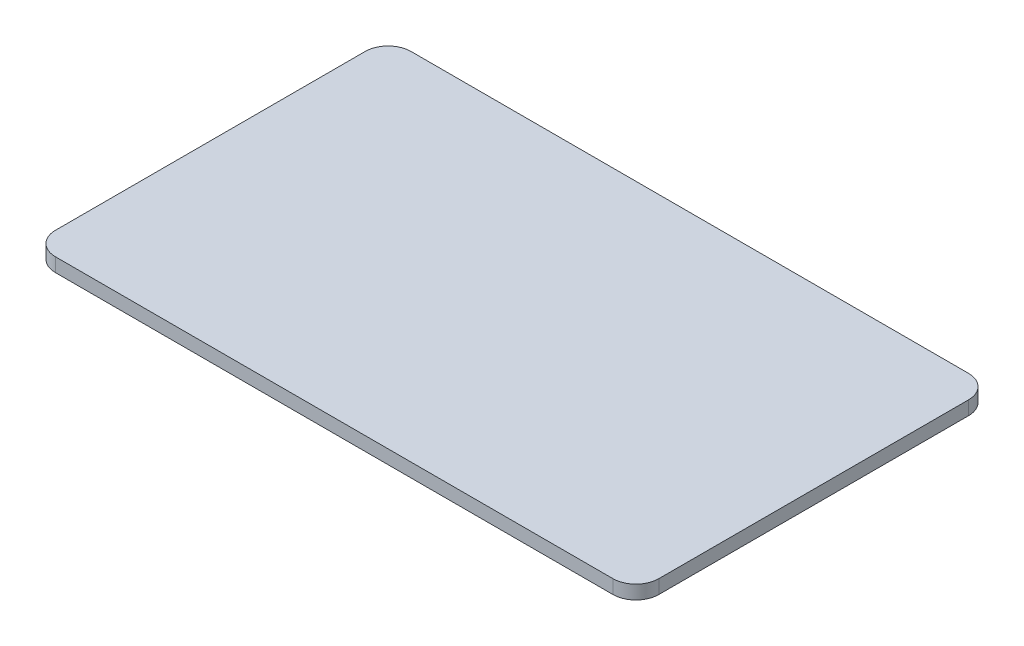
ISO-10303-21;
HEADER;
FILE_DESCRIPTION(('STEP AP214'),'2;1');
FILE_NAME('part.step','',(''),(''),'','','');
FILE_SCHEMA(('AUTOMOTIVE_DESIGN { 1 0 10303 214 1 1 1 1 }'));
ENDSEC;
DATA;
#1=APPLICATION_CONTEXT('core data for automotive mechanical design processes');
#2=APPLICATION_PROTOCOL_DEFINITION('international standard','automotive_design',2000,#1);
#3=PRODUCT_CONTEXT('',#1,'mechanical');
#4=PRODUCT('Part','Part','',(#3));
#5=PRODUCT_RELATED_PRODUCT_CATEGORY('part','',(#4));
#6=PRODUCT_DEFINITION_FORMATION('','',#4);
#7=PRODUCT_DEFINITION_CONTEXT('part definition',#1,'design');
#8=PRODUCT_DEFINITION('design','',#6,#7);
#9=PRODUCT_DEFINITION_SHAPE('','',#8);
#10=(LENGTH_UNIT() NAMED_UNIT(*) SI_UNIT(.MILLI.,.METRE.));
#11=(NAMED_UNIT(*) PLANE_ANGLE_UNIT() SI_UNIT($,.RADIAN.));
#12=(NAMED_UNIT(*) SI_UNIT($,.STERADIAN.) SOLID_ANGLE_UNIT());
#13=UNCERTAINTY_MEASURE_WITH_UNIT(LENGTH_MEASURE(1.E-05),#10,'distance_accuracy_value','');
#14=(GEOMETRIC_REPRESENTATION_CONTEXT(3) GLOBAL_UNCERTAINTY_ASSIGNED_CONTEXT((#13)) GLOBAL_UNIT_ASSIGNED_CONTEXT((#10,
#11,#12)) REPRESENTATION_CONTEXT('',''));
#15=CARTESIAN_POINT('',(0.,0.,0.));
#16=DIRECTION('',(0.,0.,1.));
#17=DIRECTION('',(1.,0.,0.));
#18=AXIS2_PLACEMENT_3D('',#15,#16,#17);
#19=CARTESIAN_POINT('',(-58.7360579092282,3.81,20.7769214580287));
#20=DIRECTION('',(0.,-1.,0.));
#21=DIRECTION('',(0.,0.,-1.));
#22=AXIS2_PLACEMENT_3D('',#19,#20,#21);
#23=CYLINDRICAL_SURFACE('',#22,6.34999999999999);
#24=CARTESIAN_POINT('',(-58.7360579092282,0.,20.7769214580287));
#25=DIRECTION('',(0.,1.,0.));
#26=DIRECTION('',(0.,0.,1.));
#27=AXIS2_PLACEMENT_3D('',#24,#25,#26);
#28=CIRCLE('',#27,6.34999999999999);
#29=CARTESIAN_POINT('',(-65.0860579092282,0.,20.7769214580287));
#30=VERTEX_POINT('',#29);
#31=CARTESIAN_POINT('',(-58.7360579092282,0.,27.1269214580288));
#32=VERTEX_POINT('',#31);
#33=EDGE_CURVE('E129',#30,#32,#28,.T.);
#34=ORIENTED_EDGE('',*,*,#33,.T.);
#35=DIRECTION('',(0.,-1.,0.));
#36=VECTOR('',#35,1.);
#37=CARTESIAN_POINT('',(-58.7360579092282,3.81,27.1269214580288));
#38=LINE('',#37,#36);
#39=CARTESIAN_POINT('',(-58.7360579092282,3.81,27.1269214580288));
#40=VERTEX_POINT('',#39);
#41=EDGE_CURVE('E11',#40,#32,#38,.T.);
#42=ORIENTED_EDGE('',*,*,#41,.F.);
#43=CARTESIAN_POINT('',(-58.7360579092282,3.81,20.7769214580287));
#44=DIRECTION('',(0.,1.,0.));
#45=DIRECTION('',(0.,0.,1.));
#46=AXIS2_PLACEMENT_3D('',#43,#44,#45);
#47=CIRCLE('',#46,6.34999999999999);
#48=CARTESIAN_POINT('',(-65.0860579092282,3.81,20.7769214580287));
#49=VERTEX_POINT('',#48);
#50=EDGE_CURVE('E143',#49,#40,#47,.T.);
#51=ORIENTED_EDGE('',*,*,#50,.F.);
#52=DIRECTION('',(0.,-1.,0.));
#53=VECTOR('',#52,1.);
#54=CARTESIAN_POINT('',(-65.0860579092282,3.81,20.7769214580287));
#55=LINE('',#54,#53);
#56=EDGE_CURVE('E125',#49,#30,#55,.T.);
#57=ORIENTED_EDGE('',*,*,#56,.T.);
#58=EDGE_LOOP('',(#34,#42,#51,#57));
#59=FACE_BOUND('',#58,.T.);
#60=ADVANCED_FACE('F33',(#59),#23,.T.);
#61=CARTESIAN_POINT('',(-58.7360579092282,3.81,27.1269214580288));
#62=DIRECTION('',(0.,0.,-1.));
#63=DIRECTION('',(-1.,0.,0.));
#64=AXIS2_PLACEMENT_3D('',#61,#62,#63);
#65=PLANE('',#64);
#66=DIRECTION('',(1.,0.,0.));
#67=VECTOR('',#66,1.);
#68=CARTESIAN_POINT('',(-58.7360579092282,0.,27.1269214580288));
#69=LINE('',#68,#67);
#70=CARTESIAN_POINT('',(95.5689420907718,0.,27.1269214580288));
#71=VERTEX_POINT('',#70);
#72=EDGE_CURVE('E132',#32,#71,#69,.T.);
#73=ORIENTED_EDGE('',*,*,#72,.T.);
#74=DIRECTION('',(0.,-1.,0.));
#75=VECTOR('',#74,1.);
#76=CARTESIAN_POINT('',(95.5689420907718,3.81,27.1269214580288));
#77=LINE('',#76,#75);
#78=CARTESIAN_POINT('',(95.5689420907718,3.81,27.1269214580288));
#79=VERTEX_POINT('',#78);
#80=EDGE_CURVE('E41',#79,#71,#77,.T.);
#81=ORIENTED_EDGE('',*,*,#80,.F.);
#82=DIRECTION('',(1.,0.,0.));
#83=VECTOR('',#82,1.);
#84=CARTESIAN_POINT('',(-58.7360579092282,3.81,27.1269214580288));
#85=LINE('',#84,#83);
#86=EDGE_CURVE('E92',#40,#79,#85,.T.);
#87=ORIENTED_EDGE('',*,*,#86,.F.);
#88=ORIENTED_EDGE('',*,*,#41,.T.);
#89=EDGE_LOOP('',(#73,#81,#87,#88));
#90=FACE_BOUND('',#89,.T.);
#91=ADVANCED_FACE('F178',(#90),#65,.F.);
#92=CARTESIAN_POINT('',(95.5689420907718,3.81,20.7769214580287));
#93=DIRECTION('',(0.,-1.,0.));
#94=DIRECTION('',(0.,0.,-1.));
#95=AXIS2_PLACEMENT_3D('',#92,#93,#94);
#96=CYLINDRICAL_SURFACE('',#95,6.35);
#97=CARTESIAN_POINT('',(95.5689420907718,0.,20.7769214580287));
#98=DIRECTION('',(0.,1.,0.));
#99=DIRECTION('',(0.,0.,1.));
#100=AXIS2_PLACEMENT_3D('',#97,#98,#99);
#101=CIRCLE('',#100,6.35);
#102=CARTESIAN_POINT('',(101.918942090772,0.,20.7769214580287));
#103=VERTEX_POINT('',#102);
#104=EDGE_CURVE('E134',#71,#103,#101,.T.);
#105=ORIENTED_EDGE('',*,*,#104,.T.);
#106=DIRECTION('',(0.,-1.,0.));
#107=VECTOR('',#106,1.);
#108=CARTESIAN_POINT('',(101.918942090772,3.81,20.7769214580287));
#109=LINE('',#108,#107);
#110=CARTESIAN_POINT('',(101.918942090772,3.81,20.7769214580287));
#111=VERTEX_POINT('',#110);
#112=EDGE_CURVE('E150',#111,#103,#109,.T.);
#113=ORIENTED_EDGE('',*,*,#112,.F.);
#114=CARTESIAN_POINT('',(95.5689420907718,3.81,20.7769214580287));
#115=DIRECTION('',(0.,1.,0.));
#116=DIRECTION('',(0.,0.,1.));
#117=AXIS2_PLACEMENT_3D('',#114,#115,#116);
#118=CIRCLE('',#117,6.35);
#119=EDGE_CURVE('E158',#79,#111,#118,.T.);
#120=ORIENTED_EDGE('',*,*,#119,.F.);
#121=ORIENTED_EDGE('',*,*,#80,.T.);
#122=EDGE_LOOP('',(#105,#113,#120,#121));
#123=FACE_BOUND('',#122,.T.);
#124=ADVANCED_FACE('F156',(#123),#96,.T.);
#125=CARTESIAN_POINT('',(101.918942090772,3.81,20.7769214580287));
#126=DIRECTION('',(-1.,0.,0.));
#127=DIRECTION('',(0.,0.,1.));
#128=AXIS2_PLACEMENT_3D('',#125,#126,#127);
#129=PLANE('',#128);
#130=DIRECTION('',(0.,0.,-1.));
#131=VECTOR('',#130,1.);
#132=CARTESIAN_POINT('',(101.918942090772,0.,20.7769214580287));
#133=LINE('',#132,#131);
#134=CARTESIAN_POINT('',(101.918942090772,0.,-64.9480785419713));
#135=VERTEX_POINT('',#134);
#136=EDGE_CURVE('E136',#103,#135,#133,.T.);
#137=ORIENTED_EDGE('',*,*,#136,.T.);
#138=DIRECTION('',(0.,-1.,0.));
#139=VECTOR('',#138,1.);
#140=CARTESIAN_POINT('',(101.918942090772,3.81,-64.9480785419713));
#141=LINE('',#140,#139);
#142=CARTESIAN_POINT('',(101.918942090772,3.81,-64.9480785419713));
#143=VERTEX_POINT('',#142);
#144=EDGE_CURVE('E147',#143,#135,#141,.T.);
#145=ORIENTED_EDGE('',*,*,#144,.F.);
#146=DIRECTION('',(0.,0.,-1.));
#147=VECTOR('',#146,1.);
#148=CARTESIAN_POINT('',(101.918942090772,3.81,20.7769214580287));
#149=LINE('',#148,#147);
#150=EDGE_CURVE('E170',#111,#143,#149,.T.);
#151=ORIENTED_EDGE('',*,*,#150,.F.);
#152=ORIENTED_EDGE('',*,*,#112,.T.);
#153=EDGE_LOOP('',(#137,#145,#151,#152));
#154=FACE_BOUND('',#153,.T.);
#155=ADVANCED_FACE('F166',(#154),#129,.F.);
#156=CARTESIAN_POINT('',(95.5689420907718,3.81,-64.9480785419713));
#157=DIRECTION('',(0.,-1.,0.));
#158=DIRECTION('',(0.,0.,-1.));
#159=AXIS2_PLACEMENT_3D('',#156,#157,#158);
#160=CYLINDRICAL_SURFACE('',#159,6.34999999999999);
#161=CARTESIAN_POINT('',(95.5689420907718,0.,-64.9480785419713));
#162=DIRECTION('',(0.,1.,0.));
#163=DIRECTION('',(0.,0.,1.));
#164=AXIS2_PLACEMENT_3D('',#161,#162,#163);
#165=CIRCLE('',#164,6.34999999999999);
#166=CARTESIAN_POINT('',(95.5689420907718,0.,-71.2980785419713));
#167=VERTEX_POINT('',#166);
#168=EDGE_CURVE('E138',#135,#167,#165,.T.);
#169=ORIENTED_EDGE('',*,*,#168,.T.);
#170=DIRECTION('',(0.,-1.,0.));
#171=VECTOR('',#170,1.);
#172=CARTESIAN_POINT('',(95.5689420907718,3.81,-71.2980785419713));
#173=LINE('',#172,#171);
#174=CARTESIAN_POINT('',(95.5689420907718,3.81,-71.2980785419713));
#175=VERTEX_POINT('',#174);
#176=EDGE_CURVE('E120',#175,#167,#173,.T.);
#177=ORIENTED_EDGE('',*,*,#176,.F.);
#178=CARTESIAN_POINT('',(95.5689420907718,3.81,-64.9480785419713));
#179=DIRECTION('',(0.,1.,0.));
#180=DIRECTION('',(0.,0.,1.));
#181=AXIS2_PLACEMENT_3D('',#178,#179,#180);
#182=CIRCLE('',#181,6.34999999999999);
#183=EDGE_CURVE('E111',#143,#175,#182,.T.);
#184=ORIENTED_EDGE('',*,*,#183,.F.);
#185=ORIENTED_EDGE('',*,*,#144,.T.);
#186=EDGE_LOOP('',(#169,#177,#184,#185));
#187=FACE_BOUND('',#186,.T.);
#188=ADVANCED_FACE('F169',(#187),#160,.T.);
#189=CARTESIAN_POINT('',(95.5689420907718,3.81,-71.2980785419713));
#190=DIRECTION('',(0.,0.,1.));
#191=DIRECTION('',(1.,0.,0.));
#192=AXIS2_PLACEMENT_3D('',#189,#190,#191);
#193=PLANE('',#192);
#194=DIRECTION('',(-1.,0.,0.));
#195=VECTOR('',#194,1.);
#196=CARTESIAN_POINT('',(95.5689420907718,0.,-71.2980785419713));
#197=LINE('',#196,#195);
#198=CARTESIAN_POINT('',(-58.7360579092282,0.,-71.2980785419712));
#199=VERTEX_POINT('',#198);
#200=EDGE_CURVE('E119',#167,#199,#197,.T.);
#201=ORIENTED_EDGE('',*,*,#200,.T.);
#202=DIRECTION('',(0.,-1.,0.));
#203=VECTOR('',#202,1.);
#204=CARTESIAN_POINT('',(-58.7360579092282,3.81,-71.2980785419712));
#205=LINE('',#204,#203);
#206=CARTESIAN_POINT('',(-58.7360579092282,3.81,-71.2980785419712));
#207=VERTEX_POINT('',#206);
#208=EDGE_CURVE('E116',#207,#199,#205,.T.);
#209=ORIENTED_EDGE('',*,*,#208,.F.);
#210=DIRECTION('',(-1.,0.,0.));
#211=VECTOR('',#210,1.);
#212=CARTESIAN_POINT('',(95.5689420907718,3.81,-71.2980785419713));
#213=LINE('',#212,#211);
#214=EDGE_CURVE('E105',#175,#207,#213,.T.);
#215=ORIENTED_EDGE('',*,*,#214,.F.);
#216=ORIENTED_EDGE('',*,*,#176,.T.);
#217=EDGE_LOOP('',(#201,#209,#215,#216));
#218=FACE_BOUND('',#217,.T.);
#219=ADVANCED_FACE('F117',(#218),#193,.F.);
#220=CARTESIAN_POINT('',(-58.7360579092282,3.81,-64.9480785419713));
#221=DIRECTION('',(0.,-1.,0.));
#222=DIRECTION('',(0.,0.,-1.));
#223=AXIS2_PLACEMENT_3D('',#220,#221,#222);
#224=CYLINDRICAL_SURFACE('',#223,6.34999999999998);
#225=CARTESIAN_POINT('',(-58.7360579092282,0.,-64.9480785419713));
#226=DIRECTION('',(0.,1.,0.));
#227=DIRECTION('',(0.,0.,1.));
#228=AXIS2_PLACEMENT_3D('',#225,#226,#227);
#229=CIRCLE('',#228,6.34999999999998);
#230=CARTESIAN_POINT('',(-65.0860579092282,0.,-64.9480785419713));
#231=VERTEX_POINT('',#230);
#232=EDGE_CURVE('E78',#199,#231,#229,.T.);
#233=ORIENTED_EDGE('',*,*,#232,.T.);
#234=DIRECTION('',(0.,-1.,0.));
#235=VECTOR('',#234,1.);
#236=CARTESIAN_POINT('',(-65.0860579092282,3.81,-64.9480785419713));
#237=LINE('',#236,#235);
#238=CARTESIAN_POINT('',(-65.0860579092282,3.81,-64.9480785419713));
#239=VERTEX_POINT('',#238);
#240=EDGE_CURVE('E121',#239,#231,#237,.T.);
#241=ORIENTED_EDGE('',*,*,#240,.F.);
#242=CARTESIAN_POINT('',(-58.7360579092282,3.81,-64.9480785419713));
#243=DIRECTION('',(0.,1.,0.));
#244=DIRECTION('',(0.,0.,1.));
#245=AXIS2_PLACEMENT_3D('',#242,#243,#244);
#246=CIRCLE('',#245,6.34999999999998);
#247=EDGE_CURVE('E109',#207,#239,#246,.T.);
#248=ORIENTED_EDGE('',*,*,#247,.F.);
#249=ORIENTED_EDGE('',*,*,#208,.T.);
#250=EDGE_LOOP('',(#233,#241,#248,#249));
#251=FACE_BOUND('',#250,.T.);
#252=ADVANCED_FACE('F123',(#251),#224,.T.);
#253=CARTESIAN_POINT('',(-65.0860579092282,3.81,-64.9480785419713));
#254=DIRECTION('',(1.,0.,0.));
#255=DIRECTION('',(0.,0.,-1.));
#256=AXIS2_PLACEMENT_3D('',#253,#254,#255);
#257=PLANE('',#256);
#258=DIRECTION('',(0.,0.,1.));
#259=VECTOR('',#258,1.);
#260=CARTESIAN_POINT('',(-65.0860579092282,0.,-64.9480785419713));
#261=LINE('',#260,#259);
#262=EDGE_CURVE('E84',#231,#30,#261,.T.);
#263=ORIENTED_EDGE('',*,*,#262,.T.);
#264=ORIENTED_EDGE('',*,*,#56,.F.);
#265=DIRECTION('',(0.,0.,1.));
#266=VECTOR('',#265,1.);
#267=CARTESIAN_POINT('',(-65.0860579092282,3.81,-64.9480785419713));
#268=LINE('',#267,#266);
#269=EDGE_CURVE('E49',#239,#49,#268,.T.);
#270=ORIENTED_EDGE('',*,*,#269,.F.);
#271=ORIENTED_EDGE('',*,*,#240,.T.);
#272=EDGE_LOOP('',(#263,#264,#270,#271));
#273=FACE_BOUND('',#272,.T.);
#274=ADVANCED_FACE('F194',(#273),#257,.F.);
#275=CARTESIAN_POINT('',(-58.7360579092282,3.81,20.7769214580287));
#276=DIRECTION('',(0.,1.,0.));
#277=DIRECTION('',(0.,0.,1.));
#278=AXIS2_PLACEMENT_3D('',#275,#276,#277);
#279=PLANE('',#278);
#280=ORIENTED_EDGE('',*,*,#50,.T.);
#281=ORIENTED_EDGE('',*,*,#86,.T.);
#282=ORIENTED_EDGE('',*,*,#119,.T.);
#283=ORIENTED_EDGE('',*,*,#150,.T.);
#284=ORIENTED_EDGE('',*,*,#183,.T.);
#285=ORIENTED_EDGE('',*,*,#214,.T.);
#286=ORIENTED_EDGE('',*,*,#247,.T.);
#287=ORIENTED_EDGE('',*,*,#269,.T.);
#288=EDGE_LOOP('',(#280,#281,#282,#283,#284,#285,#286,#287));
#289=FACE_BOUND('',#288,.T.);
#290=ADVANCED_FACE('F107',(#289),#279,.T.);
#291=CARTESIAN_POINT('',(-58.7360579092282,0.,20.7769214580287));
#292=DIRECTION('',(0.,1.,0.));
#293=DIRECTION('',(0.,0.,1.));
#294=AXIS2_PLACEMENT_3D('',#291,#292,#293);
#295=PLANE('',#294);
#296=ORIENTED_EDGE('',*,*,#33,.F.);
#297=ORIENTED_EDGE('',*,*,#262,.F.);
#298=ORIENTED_EDGE('',*,*,#232,.F.);
#299=ORIENTED_EDGE('',*,*,#200,.F.);
#300=ORIENTED_EDGE('',*,*,#168,.F.);
#301=ORIENTED_EDGE('',*,*,#136,.F.);
#302=ORIENTED_EDGE('',*,*,#104,.F.);
#303=ORIENTED_EDGE('',*,*,#72,.F.);
#304=EDGE_LOOP('',(#296,#297,#298,#299,#300,#301,#302,#303));
#305=FACE_BOUND('',#304,.T.);
#306=ADVANCED_FACE('F162',(#305),#295,.F.);
#307=CLOSED_SHELL('',(#60,#91,#124,#155,#188,#219,#252,#274,#290,#306));
#308=MANIFOLD_SOLID_BREP('B2',#307);
#309=ADVANCED_BREP_SHAPE_REPRESENTATION('',(#18,#308),#14);
#310=SHAPE_DEFINITION_REPRESENTATION(#9,#309);
ENDSEC;
END-ISO-10303-21;
